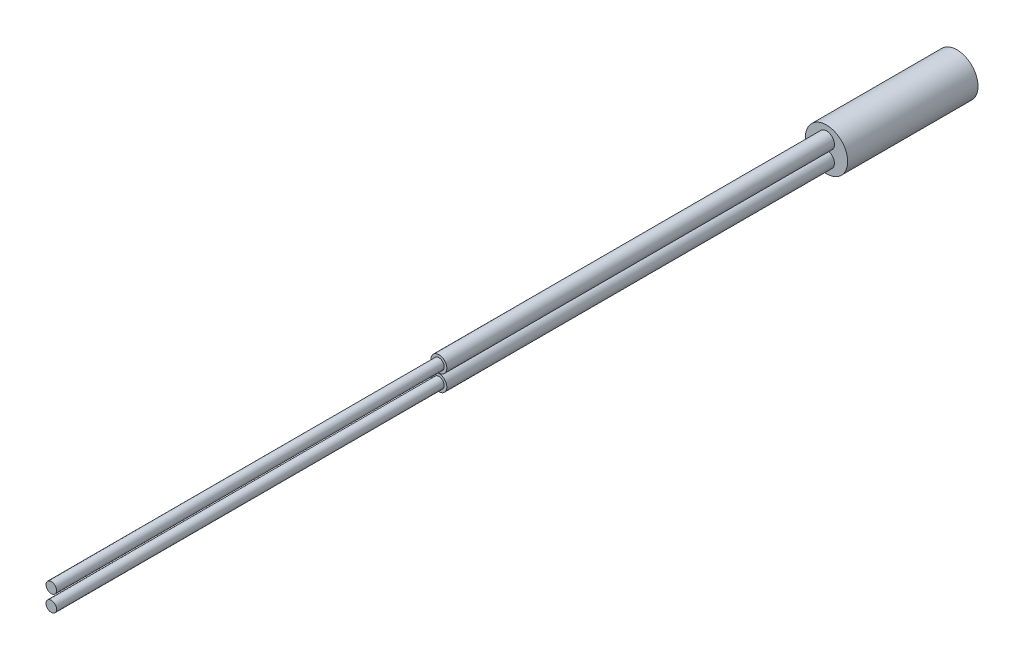
ISO-10303-21;
HEADER;
FILE_DESCRIPTION(('STEP AP214'),'2;1');
FILE_NAME('part.step','',(''),(''),'','','');
FILE_SCHEMA(('AUTOMOTIVE_DESIGN { 1 0 10303 214 1 1 1 1 }'));
ENDSEC;
DATA;
#1=APPLICATION_CONTEXT('core data for automotive mechanical design processes');
#2=APPLICATION_PROTOCOL_DEFINITION('international standard','automotive_design',2000,#1);
#3=PRODUCT_CONTEXT('',#1,'mechanical');
#4=PRODUCT('Part','Part','',(#3));
#5=PRODUCT_RELATED_PRODUCT_CATEGORY('part','',(#4));
#6=PRODUCT_DEFINITION_FORMATION('','',#4);
#7=PRODUCT_DEFINITION_CONTEXT('part definition',#1,'design');
#8=PRODUCT_DEFINITION('design','',#6,#7);
#9=PRODUCT_DEFINITION_SHAPE('','',#8);
#10=(LENGTH_UNIT() NAMED_UNIT(*) SI_UNIT(.MILLI.,.METRE.));
#11=(NAMED_UNIT(*) PLANE_ANGLE_UNIT() SI_UNIT($,.RADIAN.));
#12=(NAMED_UNIT(*) SI_UNIT($,.STERADIAN.) SOLID_ANGLE_UNIT());
#13=UNCERTAINTY_MEASURE_WITH_UNIT(LENGTH_MEASURE(1.E-05),#10,'distance_accuracy_value','');
#14=(GEOMETRIC_REPRESENTATION_CONTEXT(3) GLOBAL_UNCERTAINTY_ASSIGNED_CONTEXT((#13)) GLOBAL_UNIT_ASSIGNED_CONTEXT((#10,
#11,#12)) REPRESENTATION_CONTEXT('',''));
#15=CARTESIAN_POINT('',(0.,0.,0.));
#16=DIRECTION('',(0.,0.,1.));
#17=DIRECTION('',(1.,0.,0.));
#18=AXIS2_PLACEMENT_3D('',#15,#16,#17);
#19=CARTESIAN_POINT('',(0.,1.15,76.5));
#20=DIRECTION('',(0.,0.,1.));
#21=DIRECTION('',(1.,0.,0.));
#22=AXIS2_PLACEMENT_3D('',#19,#20,#21);
#23=PLANE('',#22);
#24=CARTESIAN_POINT('',(0.,1.15,76.5));
#25=DIRECTION('',(0.,0.,1.));
#26=DIRECTION('',(1.,0.,0.));
#27=AXIS2_PLACEMENT_3D('',#24,#25,#26);
#28=CIRCLE('',#27,1.125);
#29=CARTESIAN_POINT('',(1.125,1.15,76.5));
#30=VERTEX_POINT('',#29);
#31=EDGE_CURVE('E57',#30,#30,#28,.T.);
#32=ORIENTED_EDGE('',*,*,#31,.T.);
#33=EDGE_LOOP('',(#32));
#34=FACE_BOUND('',#33,.T.);
#35=CARTESIAN_POINT('',(0.,1.15,76.5));
#36=DIRECTION('',(0.,0.,1.));
#37=DIRECTION('',(1.,0.,0.));
#38=AXIS2_PLACEMENT_3D('',#35,#36,#37);
#39=CIRCLE('',#38,0.75);
#40=CARTESIAN_POINT('',(0.75,1.15,76.5));
#41=VERTEX_POINT('',#40);
#42=EDGE_CURVE('E38',#41,#41,#39,.F.);
#43=ORIENTED_EDGE('',*,*,#42,.T.);
#44=EDGE_LOOP('',(#43));
#45=FACE_BOUND('',#44,.T.);
#46=ADVANCED_FACE('F34',(#34,#45),#23,.T.);
#47=CARTESIAN_POINT('',(0.,-1.15,76.5));
#48=DIRECTION('',(0.,0.,1.));
#49=DIRECTION('',(1.,0.,0.));
#50=AXIS2_PLACEMENT_3D('',#47,#48,#49);
#51=PLANE('',#50);
#52=CARTESIAN_POINT('',(0.,-1.15,76.5));
#53=DIRECTION('',(0.,0.,1.));
#54=DIRECTION('',(1.,0.,0.));
#55=AXIS2_PLACEMENT_3D('',#52,#53,#54);
#56=CIRCLE('',#55,1.125);
#57=CARTESIAN_POINT('',(1.125,-1.15,76.5));
#58=VERTEX_POINT('',#57);
#59=EDGE_CURVE('E47',#58,#58,#56,.T.);
#60=ORIENTED_EDGE('',*,*,#59,.T.);
#61=EDGE_LOOP('',(#60));
#62=FACE_BOUND('',#61,.T.);
#63=CARTESIAN_POINT('',(0.,-1.15,76.5));
#64=DIRECTION('',(0.,0.,1.));
#65=DIRECTION('',(1.,0.,0.));
#66=AXIS2_PLACEMENT_3D('',#63,#64,#65);
#67=CIRCLE('',#66,0.75);
#68=CARTESIAN_POINT('',(0.75,-1.15,76.5));
#69=VERTEX_POINT('',#68);
#70=EDGE_CURVE('E50',#69,#69,#67,.F.);
#71=ORIENTED_EDGE('',*,*,#70,.T.);
#72=EDGE_LOOP('',(#71));
#73=FACE_BOUND('',#72,.T.);
#74=ADVANCED_FACE('F78',(#62,#73),#51,.T.);
#75=CARTESIAN_POINT('',(0.,0.,21.5));
#76=DIRECTION('',(0.,0.,1.));
#77=DIRECTION('',(1.,0.,0.));
#78=AXIS2_PLACEMENT_3D('',#75,#76,#77);
#79=PLANE('',#78);
#80=CARTESIAN_POINT('',(0.,-1.15,21.5));
#81=DIRECTION('',(0.,0.,1.));
#82=DIRECTION('',(1.,0.,0.));
#83=AXIS2_PLACEMENT_3D('',#80,#81,#82);
#84=CIRCLE('',#83,1.125);
#85=CARTESIAN_POINT('',(1.125,-1.15,21.5));
#86=VERTEX_POINT('',#85);
#87=EDGE_CURVE('E68',#86,#86,#84,.T.);
#88=ORIENTED_EDGE('',*,*,#87,.F.);
#89=EDGE_LOOP('',(#88));
#90=FACE_BOUND('',#89,.T.);
#91=CARTESIAN_POINT('',(0.,0.,21.5));
#92=DIRECTION('',(0.,0.,1.));
#93=DIRECTION('',(1.,0.,0.));
#94=AXIS2_PLACEMENT_3D('',#91,#92,#93);
#95=CIRCLE('',#94,3.);
#96=CARTESIAN_POINT('',(3.,0.,21.5));
#97=VERTEX_POINT('',#96);
#98=EDGE_CURVE('E10',#97,#97,#95,.T.);
#99=ORIENTED_EDGE('',*,*,#98,.T.);
#100=EDGE_LOOP('',(#99));
#101=FACE_BOUND('',#100,.T.);
#102=CARTESIAN_POINT('',(0.,1.15,21.5));
#103=DIRECTION('',(0.,0.,1.));
#104=DIRECTION('',(1.,0.,0.));
#105=AXIS2_PLACEMENT_3D('',#102,#103,#104);
#106=CIRCLE('',#105,1.125);
#107=CARTESIAN_POINT('',(1.125,1.15,21.5));
#108=VERTEX_POINT('',#107);
#109=EDGE_CURVE('E52',#108,#108,#106,.T.);
#110=ORIENTED_EDGE('',*,*,#109,.F.);
#111=EDGE_LOOP('',(#110));
#112=FACE_BOUND('',#111,.T.);
#113=ADVANCED_FACE('F76',(#90,#101,#112),#79,.T.);
#114=CARTESIAN_POINT('',(0.,0.,18.));
#115=DIRECTION('',(0.,0.,-1.));
#116=DIRECTION('',(-1.,0.,0.));
#117=AXIS2_PLACEMENT_3D('',#114,#115,#116);
#118=CYLINDRICAL_SURFACE('',#117,3.);
#119=ORIENTED_EDGE('',*,*,#98,.F.);
#120=EDGE_LOOP('',(#119));
#121=FACE_BOUND('',#120,.T.);
#122=CARTESIAN_POINT('',(0.,0.,3.));
#123=DIRECTION('',(0.,0.,-1.));
#124=DIRECTION('',(-1.,0.,0.));
#125=AXIS2_PLACEMENT_3D('',#122,#123,#124);
#126=CIRCLE('',#125,3.);
#127=CARTESIAN_POINT('',(-3.,0.,3.));
#128=VERTEX_POINT('',#127);
#129=EDGE_CURVE('E42',#128,#128,#126,.T.);
#130=ORIENTED_EDGE('',*,*,#129,.F.);
#131=EDGE_LOOP('',(#130));
#132=FACE_BOUND('',#131,.T.);
#133=ADVANCED_FACE('F36',(#121,#132),#118,.T.);
#134=CARTESIAN_POINT('',(0.,0.,3.));
#135=DIRECTION('',(0.,0.,-1.));
#136=DIRECTION('',(-1.,0.,0.));
#137=AXIS2_PLACEMENT_3D('',#134,#135,#136);
#138=PLANE('',#137);
#139=ORIENTED_EDGE('',*,*,#129,.T.);
#140=EDGE_LOOP('',(#139));
#141=FACE_BOUND('',#140,.T.);
#142=ADVANCED_FACE('F94',(#141),#138,.T.);
#143=CARTESIAN_POINT('',(0.,-1.15,76.5));
#144=DIRECTION('',(0.,0.,-1.));
#145=DIRECTION('',(-1.,0.,0.));
#146=AXIS2_PLACEMENT_3D('',#143,#144,#145);
#147=CYLINDRICAL_SURFACE('',#146,1.125);
#148=ORIENTED_EDGE('',*,*,#59,.F.);
#149=EDGE_LOOP('',(#148));
#150=FACE_BOUND('',#149,.T.);
#151=ORIENTED_EDGE('',*,*,#87,.T.);
#152=EDGE_LOOP('',(#151));
#153=FACE_BOUND('',#152,.T.);
#154=ADVANCED_FACE('F74',(#150,#153),#147,.T.);
#155=CARTESIAN_POINT('',(0.,1.15,76.5));
#156=DIRECTION('',(0.,0.,-1.));
#157=DIRECTION('',(-1.,0.,0.));
#158=AXIS2_PLACEMENT_3D('',#155,#156,#157);
#159=CYLINDRICAL_SURFACE('',#158,1.125);
#160=ORIENTED_EDGE('',*,*,#31,.F.);
#161=EDGE_LOOP('',(#160));
#162=FACE_BOUND('',#161,.T.);
#163=ORIENTED_EDGE('',*,*,#109,.T.);
#164=EDGE_LOOP('',(#163));
#165=FACE_BOUND('',#164,.T.);
#166=ADVANCED_FACE('F82',(#162,#165),#159,.T.);
#167=CARTESIAN_POINT('',(0.,-1.15,131.5));
#168=DIRECTION('',(0.,0.,-1.));
#169=DIRECTION('',(-1.,0.,0.));
#170=AXIS2_PLACEMENT_3D('',#167,#168,#169);
#171=CYLINDRICAL_SURFACE('',#170,0.75);
#172=ORIENTED_EDGE('',*,*,#70,.F.);
#173=EDGE_LOOP('',(#172));
#174=FACE_BOUND('',#173,.T.);
#175=CARTESIAN_POINT('',(0.,-1.15,131.5));
#176=DIRECTION('',(0.,0.,1.));
#177=DIRECTION('',(1.,0.,0.));
#178=AXIS2_PLACEMENT_3D('',#175,#176,#177);
#179=CIRCLE('',#178,0.75);
#180=CARTESIAN_POINT('',(0.75,-1.15,131.5));
#181=VERTEX_POINT('',#180);
#182=EDGE_CURVE('E53',#181,#181,#179,.T.);
#183=ORIENTED_EDGE('',*,*,#182,.F.);
#184=EDGE_LOOP('',(#183));
#185=FACE_BOUND('',#184,.T.);
#186=ADVANCED_FACE('F84',(#174,#185),#171,.T.);
#187=CARTESIAN_POINT('',(0.,-1.15,131.5));
#188=DIRECTION('',(0.,0.,1.));
#189=DIRECTION('',(1.,0.,0.));
#190=AXIS2_PLACEMENT_3D('',#187,#188,#189);
#191=PLANE('',#190);
#192=ORIENTED_EDGE('',*,*,#182,.T.);
#193=EDGE_LOOP('',(#192));
#194=FACE_BOUND('',#193,.T.);
#195=ADVANCED_FACE('F91',(#194),#191,.T.);
#196=CARTESIAN_POINT('',(0.,1.15,131.5));
#197=DIRECTION('',(0.,0.,-1.));
#198=DIRECTION('',(-1.,0.,0.));
#199=AXIS2_PLACEMENT_3D('',#196,#197,#198);
#200=CYLINDRICAL_SURFACE('',#199,0.75);
#201=ORIENTED_EDGE('',*,*,#42,.F.);
#202=EDGE_LOOP('',(#201));
#203=FACE_BOUND('',#202,.T.);
#204=CARTESIAN_POINT('',(0.,1.15,131.5));
#205=DIRECTION('',(0.,0.,1.));
#206=DIRECTION('',(1.,0.,0.));
#207=AXIS2_PLACEMENT_3D('',#204,#205,#206);
#208=CIRCLE('',#207,0.75);
#209=CARTESIAN_POINT('',(0.75,1.15,131.5));
#210=VERTEX_POINT('',#209);
#211=EDGE_CURVE('E64',#210,#210,#208,.T.);
#212=ORIENTED_EDGE('',*,*,#211,.F.);
#213=EDGE_LOOP('',(#212));
#214=FACE_BOUND('',#213,.T.);
#215=ADVANCED_FACE('F110',(#203,#214),#200,.T.);
#216=CARTESIAN_POINT('',(0.,1.15,131.5));
#217=DIRECTION('',(0.,0.,1.));
#218=DIRECTION('',(1.,0.,0.));
#219=AXIS2_PLACEMENT_3D('',#216,#217,#218);
#220=PLANE('',#219);
#221=ORIENTED_EDGE('',*,*,#211,.T.);
#222=EDGE_LOOP('',(#221));
#223=FACE_BOUND('',#222,.T.);
#224=ADVANCED_FACE('F113',(#223),#220,.T.);
#225=CLOSED_SHELL('',(#46,#74,#113,#133,#142,#154,#166,#186,#195,#215,#224));
#226=MANIFOLD_SOLID_BREP('B2',#225);
#227=ADVANCED_BREP_SHAPE_REPRESENTATION('',(#18,#226),#14);
#228=SHAPE_DEFINITION_REPRESENTATION(#9,#227);
ENDSEC;
END-ISO-10303-21;
